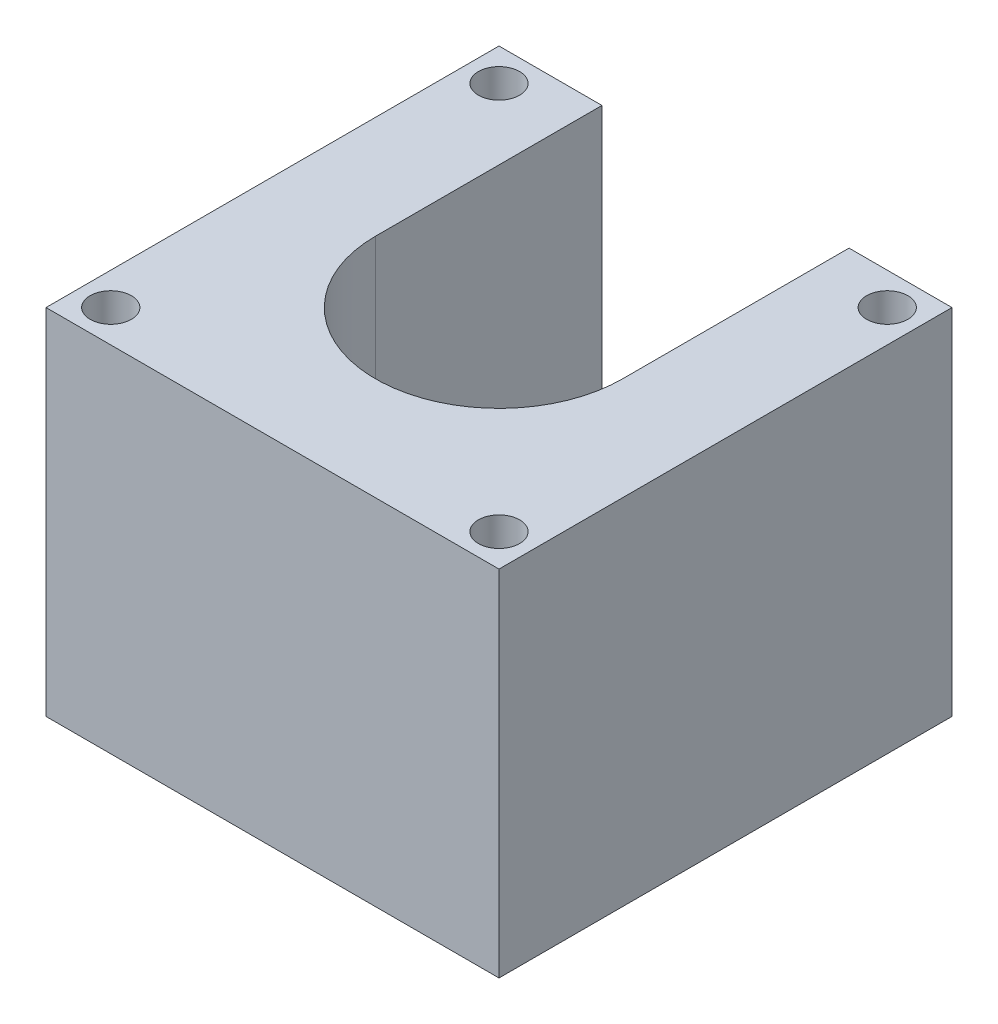
ISO-10303-21;
HEADER;
FILE_DESCRIPTION(('STEP AP214'),'2;1');
FILE_NAME('part.step','',(''),(''),'','','');
FILE_SCHEMA(('AUTOMOTIVE_DESIGN { 1 0 10303 214 1 1 1 1 }'));
ENDSEC;
DATA;
#1=APPLICATION_CONTEXT('core data for automotive mechanical design processes');
#2=APPLICATION_PROTOCOL_DEFINITION('international standard','automotive_design',2000,#1);
#3=PRODUCT_CONTEXT('',#1,'mechanical');
#4=PRODUCT('Part','Part','',(#3));
#5=PRODUCT_RELATED_PRODUCT_CATEGORY('part','',(#4));
#6=PRODUCT_DEFINITION_FORMATION('','',#4);
#7=PRODUCT_DEFINITION_CONTEXT('part definition',#1,'design');
#8=PRODUCT_DEFINITION('design','',#6,#7);
#9=PRODUCT_DEFINITION_SHAPE('','',#8);
#10=(LENGTH_UNIT() NAMED_UNIT(*) SI_UNIT(.MILLI.,.METRE.));
#11=(NAMED_UNIT(*) PLANE_ANGLE_UNIT() SI_UNIT($,.RADIAN.));
#12=(NAMED_UNIT(*) SI_UNIT($,.STERADIAN.) SOLID_ANGLE_UNIT());
#13=UNCERTAINTY_MEASURE_WITH_UNIT(LENGTH_MEASURE(1.E-05),#10,'distance_accuracy_value','');
#14=(GEOMETRIC_REPRESENTATION_CONTEXT(3) GLOBAL_UNCERTAINTY_ASSIGNED_CONTEXT((#13)) GLOBAL_UNIT_ASSIGNED_CONTEXT((#10,
#11,#12)) REPRESENTATION_CONTEXT('',''));
#15=CARTESIAN_POINT('',(0.,0.,0.));
#16=DIRECTION('',(0.,0.,1.));
#17=DIRECTION('',(1.,0.,0.));
#18=AXIS2_PLACEMENT_3D('',#15,#16,#17);
#19=CARTESIAN_POINT('',(0.,9.,0.));
#20=DIRECTION('',(0.,1.,0.));
#21=DIRECTION('',(0.,0.,1.));
#22=AXIS2_PLACEMENT_3D('',#19,#20,#21);
#23=PLANE('',#22);
#24=CARTESIAN_POINT('',(-0.141805914216586,9.,-1.24028438149424));
#25=DIRECTION('',(0.,1.,0.));
#26=DIRECTION('',(0.,0.,1.));
#27=AXIS2_PLACEMENT_3D('',#24,#25,#26);
#28=CIRCLE('',#27,15.);
#29=CARTESIAN_POINT('',(14.8581940857834,9.,-1.24028438149424));
#30=VERTEX_POINT('',#29);
#31=CARTESIAN_POINT('',(-15.1418059142166,9.,-1.24028438149424));
#32=VERTEX_POINT('',#31);
#33=EDGE_CURVE('E55',#30,#32,#28,.T.);
#34=ORIENTED_EDGE('',*,*,#33,.F.);
#35=DIRECTION('',(0.,0.,-1.));
#36=VECTOR('',#35,1.);
#37=CARTESIAN_POINT('',(14.8581940857834,9.,0.));
#38=LINE('',#37,#36);
#39=CARTESIAN_POINT('',(14.8581940857834,9.,-28.7402843814942));
#40=VERTEX_POINT('',#39);
#41=EDGE_CURVE('E105',#30,#40,#38,.T.);
#42=ORIENTED_EDGE('',*,*,#41,.T.);
#43=DIRECTION('',(-1.,0.,0.));
#44=VECTOR('',#43,1.);
#45=CARTESIAN_POINT('',(-27.6418059142166,9.,-28.7402843814942));
#46=LINE('',#45,#44);
#47=CARTESIAN_POINT('',(-15.1418059142166,9.,-28.7402843814942));
#48=VERTEX_POINT('',#47);
#49=EDGE_CURVE('E168',#40,#48,#46,.T.);
#50=ORIENTED_EDGE('',*,*,#49,.T.);
#51=DIRECTION('',(0.,0.,-1.));
#52=VECTOR('',#51,1.);
#53=CARTESIAN_POINT('',(-15.1418059142166,9.,0.));
#54=LINE('',#53,#52);
#55=EDGE_CURVE('E51',#32,#48,#54,.T.);
#56=ORIENTED_EDGE('',*,*,#55,.F.);
#57=EDGE_LOOP('',(#34,#42,#50,#56));
#58=FACE_BOUND('',#57,.T.);
#59=ADVANCED_FACE('F34',(#58),#23,.T.);
#60=CARTESIAN_POINT('',(0.,0.,0.));
#61=DIRECTION('',(0.,1.,0.));
#62=DIRECTION('',(0.,0.,1.));
#63=AXIS2_PLACEMENT_3D('',#60,#61,#62);
#64=PLANE('',#63);
#65=CARTESIAN_POINT('',(23.4281940857834,0.,-24.8102843814942));
#66=DIRECTION('',(0.,-1.,0.));
#67=DIRECTION('',(0.,0.,-1.));
#68=AXIS2_PLACEMENT_3D('',#65,#66,#67);
#69=CIRCLE('',#68,2.5);
#70=CARTESIAN_POINT('',(23.4281940857834,0.,-27.3102843814942));
#71=VERTEX_POINT('',#70);
#72=EDGE_CURVE('E258',#71,#71,#69,.T.);
#73=ORIENTED_EDGE('',*,*,#72,.F.);
#74=EDGE_LOOP('',(#73));
#75=FACE_BOUND('',#74,.T.);
#76=CARTESIAN_POINT('',(-23.7118059142166,0.,-24.8102843814942));
#77=DIRECTION('',(0.,-1.,0.));
#78=DIRECTION('',(0.,0.,-1.));
#79=AXIS2_PLACEMENT_3D('',#76,#77,#78);
#80=CIRCLE('',#79,2.5);
#81=CARTESIAN_POINT('',(-23.7118059142166,0.,-27.3102843814942));
#82=VERTEX_POINT('',#81);
#83=EDGE_CURVE('E262',#82,#82,#80,.T.);
#84=ORIENTED_EDGE('',*,*,#83,.F.);
#85=EDGE_LOOP('',(#84));
#86=FACE_BOUND('',#85,.T.);
#87=CARTESIAN_POINT('',(23.4281940857834,0.,22.3297156185058));
#88=DIRECTION('',(0.,-1.,0.));
#89=DIRECTION('',(0.,0.,-1.));
#90=AXIS2_PLACEMENT_3D('',#87,#88,#89);
#91=CIRCLE('',#90,2.5);
#92=CARTESIAN_POINT('',(23.4281940857834,0.,19.8297156185058));
#93=VERTEX_POINT('',#92);
#94=EDGE_CURVE('E269',#93,#93,#91,.T.);
#95=ORIENTED_EDGE('',*,*,#94,.F.);
#96=EDGE_LOOP('',(#95));
#97=FACE_BOUND('',#96,.T.);
#98=CARTESIAN_POINT('',(-23.7118059142166,0.,22.3297156185058));
#99=DIRECTION('',(0.,-1.,0.));
#100=DIRECTION('',(0.,0.,-1.));
#101=AXIS2_PLACEMENT_3D('',#98,#99,#100);
#102=CIRCLE('',#101,2.5);
#103=CARTESIAN_POINT('',(-23.7118059142166,0.,19.8297156185058));
#104=VERTEX_POINT('',#103);
#105=EDGE_CURVE('E148',#104,#104,#102,.T.);
#106=ORIENTED_EDGE('',*,*,#105,.F.);
#107=EDGE_LOOP('',(#106));
#108=FACE_BOUND('',#107,.T.);
#109=DIRECTION('',(0.,0.,1.));
#110=VECTOR('',#109,1.);
#111=CARTESIAN_POINT('',(-27.6418059142166,0.,-28.7402843814942));
#112=LINE('',#111,#110);
#113=CARTESIAN_POINT('',(-27.6418059142166,0.,-28.7402843814942));
#114=VERTEX_POINT('',#113);
#115=CARTESIAN_POINT('',(-27.6418059142166,0.,26.2597156185058));
#116=VERTEX_POINT('',#115);
#117=EDGE_CURVE('E167',#114,#116,#112,.T.);
#118=ORIENTED_EDGE('',*,*,#117,.F.);
#119=DIRECTION('',(-1.,0.,0.));
#120=VECTOR('',#119,1.);
#121=CARTESIAN_POINT('',(-27.6418059142166,0.,-28.7402843814942));
#122=LINE('',#121,#120);
#123=CARTESIAN_POINT('',(27.3581940857834,0.,-28.7402843814942));
#124=VERTEX_POINT('',#123);
#125=EDGE_CURVE('E171',#124,#114,#122,.T.);
#126=ORIENTED_EDGE('',*,*,#125,.F.);
#127=DIRECTION('',(0.,0.,-1.));
#128=VECTOR('',#127,1.);
#129=CARTESIAN_POINT('',(27.3581940857834,0.,-28.7402843814942));
#130=LINE('',#129,#128);
#131=CARTESIAN_POINT('',(27.3581940857834,0.,26.2597156185058));
#132=VERTEX_POINT('',#131);
#133=EDGE_CURVE('E179',#132,#124,#130,.T.);
#134=ORIENTED_EDGE('',*,*,#133,.F.);
#135=DIRECTION('',(1.,0.,0.));
#136=VECTOR('',#135,1.);
#137=CARTESIAN_POINT('',(-27.6418059142166,0.,26.2597156185058));
#138=LINE('',#137,#136);
#139=EDGE_CURVE('E177',#116,#132,#138,.T.);
#140=ORIENTED_EDGE('',*,*,#139,.F.);
#141=EDGE_LOOP('',(#118,#126,#134,#140));
#142=FACE_BOUND('',#141,.T.);
#143=CARTESIAN_POINT('',(-0.141805914216586,0.,-1.24028438149424));
#144=DIRECTION('',(0.,1.,0.));
#145=DIRECTION('',(0.,0.,1.));
#146=AXIS2_PLACEMENT_3D('',#143,#144,#145);
#147=CIRCLE('',#146,15.);
#148=CARTESIAN_POINT('',(-0.141805914216586,0.,13.7597156185058));
#149=VERTEX_POINT('',#148);
#150=EDGE_CURVE('E107',#149,#149,#147,.T.);
#151=ORIENTED_EDGE('',*,*,#150,.T.);
#152=EDGE_LOOP('',(#151));
#153=FACE_BOUND('',#152,.T.);
#154=ADVANCED_FACE('F196',(#75,#86,#97,#108,#142,#153),#64,.F.);
#155=CARTESIAN_POINT('',(-27.6418059142166,9.,-28.7402843814942));
#156=DIRECTION('',(1.,0.,0.));
#157=DIRECTION('',(0.,0.,-1.));
#158=AXIS2_PLACEMENT_3D('',#155,#156,#157);
#159=PLANE('',#158);
#160=ORIENTED_EDGE('',*,*,#117,.T.);
#161=DIRECTION('',(0.,-1.,0.));
#162=VECTOR('',#161,1.);
#163=CARTESIAN_POINT('',(-27.6418059142166,9.,26.2597156185058));
#164=LINE('',#163,#162);
#165=CARTESIAN_POINT('',(-27.6418059142166,43.,26.2597156185058));
#166=VERTEX_POINT('',#165);
#167=EDGE_CURVE('E11',#166,#116,#164,.T.);
#168=ORIENTED_EDGE('',*,*,#167,.F.);
#169=DIRECTION('',(0.,0.,1.));
#170=VECTOR('',#169,1.);
#171=CARTESIAN_POINT('',(-27.6418059142166,43.,0.));
#172=LINE('',#171,#170);
#173=CARTESIAN_POINT('',(-27.6418059142166,43.,-28.7402843814942));
#174=VERTEX_POINT('',#173);
#175=EDGE_CURVE('E134',#174,#166,#172,.T.);
#176=ORIENTED_EDGE('',*,*,#175,.F.);
#177=DIRECTION('',(0.,-1.,0.));
#178=VECTOR('',#177,1.);
#179=CARTESIAN_POINT('',(-27.6418059142166,9.,-28.7402843814942));
#180=LINE('',#179,#178);
#181=EDGE_CURVE('E170',#174,#114,#180,.T.);
#182=ORIENTED_EDGE('',*,*,#181,.T.);
#183=EDGE_LOOP('',(#160,#168,#176,#182));
#184=FACE_BOUND('',#183,.T.);
#185=ADVANCED_FACE('F36',(#184),#159,.F.);
#186=CARTESIAN_POINT('',(-27.6418059142166,9.,26.2597156185058));
#187=DIRECTION('',(0.,0.,-1.));
#188=DIRECTION('',(-1.,0.,0.));
#189=AXIS2_PLACEMENT_3D('',#186,#187,#188);
#190=PLANE('',#189);
#191=ORIENTED_EDGE('',*,*,#139,.T.);
#192=DIRECTION('',(0.,-1.,0.));
#193=VECTOR('',#192,1.);
#194=CARTESIAN_POINT('',(27.3581940857834,9.,26.2597156185058));
#195=LINE('',#194,#193);
#196=CARTESIAN_POINT('',(27.3581940857834,43.,26.2597156185058));
#197=VERTEX_POINT('',#196);
#198=EDGE_CURVE('E43',#197,#132,#195,.T.);
#199=ORIENTED_EDGE('',*,*,#198,.F.);
#200=DIRECTION('',(1.,0.,0.));
#201=VECTOR('',#200,1.);
#202=CARTESIAN_POINT('',(0.,43.,26.2597156185058));
#203=LINE('',#202,#201);
#204=EDGE_CURVE('E137',#166,#197,#203,.T.);
#205=ORIENTED_EDGE('',*,*,#204,.F.);
#206=ORIENTED_EDGE('',*,*,#167,.T.);
#207=EDGE_LOOP('',(#191,#199,#205,#206));
#208=FACE_BOUND('',#207,.T.);
#209=ADVANCED_FACE('F201',(#208),#190,.F.);
#210=CARTESIAN_POINT('',(27.3581940857834,9.,-28.7402843814942));
#211=DIRECTION('',(-1.,0.,0.));
#212=DIRECTION('',(0.,0.,1.));
#213=AXIS2_PLACEMENT_3D('',#210,#211,#212);
#214=PLANE('',#213);
#215=ORIENTED_EDGE('',*,*,#133,.T.);
#216=DIRECTION('',(0.,-1.,0.));
#217=VECTOR('',#216,1.);
#218=CARTESIAN_POINT('',(27.3581940857834,9.,-28.7402843814942));
#219=LINE('',#218,#217);
#220=CARTESIAN_POINT('',(27.3581940857834,43.,-28.7402843814942));
#221=VERTEX_POINT('',#220);
#222=EDGE_CURVE('E184',#221,#124,#219,.T.);
#223=ORIENTED_EDGE('',*,*,#222,.F.);
#224=DIRECTION('',(0.,0.,-1.));
#225=VECTOR('',#224,1.);
#226=CARTESIAN_POINT('',(27.3581940857834,43.,0.));
#227=LINE('',#226,#225);
#228=EDGE_CURVE('E140',#197,#221,#227,.T.);
#229=ORIENTED_EDGE('',*,*,#228,.F.);
#230=ORIENTED_EDGE('',*,*,#198,.T.);
#231=EDGE_LOOP('',(#215,#223,#229,#230));
#232=FACE_BOUND('',#231,.T.);
#233=ADVANCED_FACE('F190',(#232),#214,.F.);
#234=CARTESIAN_POINT('',(-27.6418059142166,9.,-28.7402843814942));
#235=DIRECTION('',(0.,0.,1.));
#236=DIRECTION('',(1.,0.,0.));
#237=AXIS2_PLACEMENT_3D('',#234,#235,#236);
#238=PLANE('',#237);
#239=ORIENTED_EDGE('',*,*,#125,.T.);
#240=ORIENTED_EDGE('',*,*,#181,.F.);
#241=DIRECTION('',(-1.,0.,0.));
#242=VECTOR('',#241,1.);
#243=CARTESIAN_POINT('',(0.,43.,-28.7402843814942));
#244=LINE('',#243,#242);
#245=CARTESIAN_POINT('',(-15.1418059142166,43.,-28.7402843814942));
#246=VERTEX_POINT('',#245);
#247=EDGE_CURVE('E131',#246,#174,#244,.T.);
#248=ORIENTED_EDGE('',*,*,#247,.F.);
#249=DIRECTION('',(0.,-1.,0.));
#250=VECTOR('',#249,1.);
#251=CARTESIAN_POINT('',(-15.1418059142166,43.,-28.7402843814942));
#252=LINE('',#251,#250);
#253=EDGE_CURVE('E151',#246,#48,#252,.T.);
#254=ORIENTED_EDGE('',*,*,#253,.T.);
#255=ORIENTED_EDGE('',*,*,#49,.F.);
#256=DIRECTION('',(0.,-1.,0.));
#257=VECTOR('',#256,1.);
#258=CARTESIAN_POINT('',(14.8581940857834,43.,-28.7402843814942));
#259=LINE('',#258,#257);
#260=CARTESIAN_POINT('',(14.8581940857834,43.,-28.7402843814942));
#261=VERTEX_POINT('',#260);
#262=EDGE_CURVE('E150',#261,#40,#259,.T.);
#263=ORIENTED_EDGE('',*,*,#262,.F.);
#264=EDGE_CURVE('E122',#221,#261,#244,.T.);
#265=ORIENTED_EDGE('',*,*,#264,.F.);
#266=ORIENTED_EDGE('',*,*,#222,.T.);
#267=EDGE_LOOP('',(#239,#240,#248,#254,#255,#263,#265,#266));
#268=FACE_BOUND('',#267,.T.);
#269=ADVANCED_FACE('F198',(#268),#238,.F.);
#270=CARTESIAN_POINT('',(-0.141805914216586,9.,-1.24028438149424));
#271=DIRECTION('',(0.,-1.,0.));
#272=DIRECTION('',(0.,0.,-1.));
#273=AXIS2_PLACEMENT_3D('',#270,#271,#272);
#274=CYLINDRICAL_SURFACE('',#273,15.);
#275=ORIENTED_EDGE('',*,*,#33,.T.);
#276=DIRECTION('',(0.,-1.,0.));
#277=VECTOR('',#276,1.);
#278=CARTESIAN_POINT('',(-15.1418059142166,43.,-1.24028438149424));
#279=LINE('',#278,#277);
#280=CARTESIAN_POINT('',(-15.1418059142166,43.,-1.24028438149424));
#281=VERTEX_POINT('',#280);
#282=EDGE_CURVE('E108',#281,#32,#279,.T.);
#283=ORIENTED_EDGE('',*,*,#282,.F.);
#284=CARTESIAN_POINT('',(-0.141805914216586,43.,-1.24028438149424));
#285=DIRECTION('',(0.,1.,0.));
#286=DIRECTION('',(0.,0.,1.));
#287=AXIS2_PLACEMENT_3D('',#284,#285,#286);
#288=CIRCLE('',#287,15.);
#289=CARTESIAN_POINT('',(14.8581940857834,43.,-1.24028438149424));
#290=VERTEX_POINT('',#289);
#291=EDGE_CURVE('E111',#290,#281,#288,.F.);
#292=ORIENTED_EDGE('',*,*,#291,.F.);
#293=DIRECTION('',(0.,-1.,0.));
#294=VECTOR('',#293,1.);
#295=CARTESIAN_POINT('',(14.8581940857834,43.,-1.24028438149424));
#296=LINE('',#295,#294);
#297=EDGE_CURVE('E99',#290,#30,#296,.T.);
#298=ORIENTED_EDGE('',*,*,#297,.T.);
#299=EDGE_LOOP('',(#275,#283,#292,#298));
#300=FACE_BOUND('',#299,.T.);
#301=ORIENTED_EDGE('',*,*,#150,.F.);
#302=EDGE_LOOP('',(#301));
#303=FACE_BOUND('',#302,.T.);
#304=ADVANCED_FACE('F112',(#300,#303),#274,.F.);
#305=CARTESIAN_POINT('',(14.8581940857834,43.,0.));
#306=DIRECTION('',(-1.,0.,0.));
#307=DIRECTION('',(0.,0.,1.));
#308=AXIS2_PLACEMENT_3D('',#305,#306,#307);
#309=PLANE('',#308);
#310=ORIENTED_EDGE('',*,*,#41,.F.);
#311=ORIENTED_EDGE('',*,*,#297,.F.);
#312=DIRECTION('',(0.,0.,-1.));
#313=VECTOR('',#312,1.);
#314=CARTESIAN_POINT('',(14.8581940857834,43.,0.));
#315=LINE('',#314,#313);
#316=EDGE_CURVE('E104',#290,#261,#315,.T.);
#317=ORIENTED_EDGE('',*,*,#316,.T.);
#318=ORIENTED_EDGE('',*,*,#262,.T.);
#319=EDGE_LOOP('',(#310,#311,#317,#318));
#320=FACE_BOUND('',#319,.T.);
#321=ADVANCED_FACE('F101',(#320),#309,.T.);
#322=CARTESIAN_POINT('',(-15.1418059142166,43.,0.));
#323=DIRECTION('',(-1.,0.,0.));
#324=DIRECTION('',(0.,0.,1.));
#325=AXIS2_PLACEMENT_3D('',#322,#323,#324);
#326=PLANE('',#325);
#327=ORIENTED_EDGE('',*,*,#55,.T.);
#328=ORIENTED_EDGE('',*,*,#253,.F.);
#329=DIRECTION('',(0.,0.,-1.));
#330=VECTOR('',#329,1.);
#331=CARTESIAN_POINT('',(-15.1418059142166,43.,0.));
#332=LINE('',#331,#330);
#333=EDGE_CURVE('E117',#281,#246,#332,.T.);
#334=ORIENTED_EDGE('',*,*,#333,.F.);
#335=ORIENTED_EDGE('',*,*,#282,.T.);
#336=EDGE_LOOP('',(#327,#328,#334,#335));
#337=FACE_BOUND('',#336,.T.);
#338=ADVANCED_FACE('F225',(#337),#326,.F.);
#339=CARTESIAN_POINT('',(0.,43.,0.));
#340=DIRECTION('',(0.,1.,0.));
#341=DIRECTION('',(0.,0.,1.));
#342=AXIS2_PLACEMENT_3D('',#339,#340,#341);
#343=PLANE('',#342);
#344=CARTESIAN_POINT('',(23.4281940857834,43.,-24.8102843814942));
#345=DIRECTION('',(0.,1.,0.));
#346=DIRECTION('',(0.,0.,1.));
#347=AXIS2_PLACEMENT_3D('',#344,#345,#346);
#348=CIRCLE('',#347,2.5);
#349=CARTESIAN_POINT('',(23.4281940857834,43.,-22.3102843814942));
#350=VERTEX_POINT('',#349);
#351=EDGE_CURVE('E255',#350,#350,#348,.F.);
#352=ORIENTED_EDGE('',*,*,#351,.T.);
#353=EDGE_LOOP('',(#352));
#354=FACE_BOUND('',#353,.T.);
#355=CARTESIAN_POINT('',(-23.7118059142166,43.,-24.8102843814942));
#356=DIRECTION('',(0.,1.,0.));
#357=DIRECTION('',(0.,0.,1.));
#358=AXIS2_PLACEMENT_3D('',#355,#356,#357);
#359=CIRCLE('',#358,2.5);
#360=CARTESIAN_POINT('',(-23.7118059142166,43.,-22.3102843814942));
#361=VERTEX_POINT('',#360);
#362=EDGE_CURVE('E259',#361,#361,#359,.F.);
#363=ORIENTED_EDGE('',*,*,#362,.T.);
#364=EDGE_LOOP('',(#363));
#365=FACE_BOUND('',#364,.T.);
#366=CARTESIAN_POINT('',(23.4281940857834,43.,22.3297156185058));
#367=DIRECTION('',(0.,1.,0.));
#368=DIRECTION('',(0.,0.,1.));
#369=AXIS2_PLACEMENT_3D('',#366,#367,#368);
#370=CIRCLE('',#369,2.5);
#371=CARTESIAN_POINT('',(23.4281940857834,43.,24.8297156185058));
#372=VERTEX_POINT('',#371);
#373=EDGE_CURVE('E267',#372,#372,#370,.F.);
#374=ORIENTED_EDGE('',*,*,#373,.T.);
#375=EDGE_LOOP('',(#374));
#376=FACE_BOUND('',#375,.T.);
#377=CARTESIAN_POINT('',(-23.7118059142166,43.,22.3297156185058));
#378=DIRECTION('',(0.,1.,0.));
#379=DIRECTION('',(0.,0.,1.));
#380=AXIS2_PLACEMENT_3D('',#377,#378,#379);
#381=CIRCLE('',#380,2.5);
#382=CARTESIAN_POINT('',(-23.7118059142166,43.,24.8297156185058));
#383=VERTEX_POINT('',#382);
#384=EDGE_CURVE('E127',#383,#383,#381,.F.);
#385=ORIENTED_EDGE('',*,*,#384,.T.);
#386=EDGE_LOOP('',(#385));
#387=FACE_BOUND('',#386,.T.);
#388=ORIENTED_EDGE('',*,*,#316,.F.);
#389=ORIENTED_EDGE('',*,*,#291,.T.);
#390=ORIENTED_EDGE('',*,*,#333,.T.);
#391=ORIENTED_EDGE('',*,*,#247,.T.);
#392=ORIENTED_EDGE('',*,*,#175,.T.);
#393=ORIENTED_EDGE('',*,*,#204,.T.);
#394=ORIENTED_EDGE('',*,*,#228,.T.);
#395=ORIENTED_EDGE('',*,*,#264,.T.);
#396=EDGE_LOOP('',(#388,#389,#390,#391,#392,#393,#394,#395));
#397=FACE_BOUND('',#396,.T.);
#398=ADVANCED_FACE('F119',(#354,#365,#376,#387,#397),#343,.T.);
#399=CARTESIAN_POINT('',(-23.7118059142166,43.001025,22.3297156185058));
#400=DIRECTION('',(0.,-1.,0.));
#401=DIRECTION('',(0.,0.,-1.));
#402=AXIS2_PLACEMENT_3D('',#399,#400,#401);
#403=CYLINDRICAL_SURFACE('',#402,2.5);
#404=ORIENTED_EDGE('',*,*,#384,.F.);
#405=EDGE_LOOP('',(#404));
#406=FACE_BOUND('',#405,.T.);
#407=ORIENTED_EDGE('',*,*,#105,.T.);
#408=EDGE_LOOP('',(#407));
#409=FACE_BOUND('',#408,.T.);
#410=ADVANCED_FACE('F234',(#406,#409),#403,.F.);
#411=CARTESIAN_POINT('',(23.4281940857834,43.001025,22.3297156185058));
#412=DIRECTION('',(0.,-1.,0.));
#413=DIRECTION('',(0.,0.,-1.));
#414=AXIS2_PLACEMENT_3D('',#411,#412,#413);
#415=CYLINDRICAL_SURFACE('',#414,2.5);
#416=ORIENTED_EDGE('',*,*,#373,.F.);
#417=EDGE_LOOP('',(#416));
#418=FACE_BOUND('',#417,.T.);
#419=ORIENTED_EDGE('',*,*,#94,.T.);
#420=EDGE_LOOP('',(#419));
#421=FACE_BOUND('',#420,.T.);
#422=ADVANCED_FACE('F238',(#418,#421),#415,.F.);
#423=CARTESIAN_POINT('',(-23.7118059142166,43.001025,-24.8102843814942));
#424=DIRECTION('',(0.,-1.,0.));
#425=DIRECTION('',(0.,0.,-1.));
#426=AXIS2_PLACEMENT_3D('',#423,#424,#425);
#427=CYLINDRICAL_SURFACE('',#426,2.5);
#428=ORIENTED_EDGE('',*,*,#362,.F.);
#429=EDGE_LOOP('',(#428));
#430=FACE_BOUND('',#429,.T.);
#431=ORIENTED_EDGE('',*,*,#83,.T.);
#432=EDGE_LOOP('',(#431));
#433=FACE_BOUND('',#432,.T.);
#434=ADVANCED_FACE('F242',(#430,#433),#427,.F.);
#435=CARTESIAN_POINT('',(23.4281940857834,43.001025,-24.8102843814942));
#436=DIRECTION('',(0.,-1.,0.));
#437=DIRECTION('',(0.,0.,-1.));
#438=AXIS2_PLACEMENT_3D('',#435,#436,#437);
#439=CYLINDRICAL_SURFACE('',#438,2.5);
#440=ORIENTED_EDGE('',*,*,#351,.F.);
#441=EDGE_LOOP('',(#440));
#442=FACE_BOUND('',#441,.T.);
#443=ORIENTED_EDGE('',*,*,#72,.T.);
#444=EDGE_LOOP('',(#443));
#445=FACE_BOUND('',#444,.T.);
#446=ADVANCED_FACE('F246',(#442,#445),#439,.F.);
#447=CLOSED_SHELL('',(#59,#154,#185,#209,#233,#269,#304,#321,#338,#398,#410,#422,#434,#446));
#448=MANIFOLD_SOLID_BREP('B2',#447);
#449=ADVANCED_BREP_SHAPE_REPRESENTATION('',(#18,#448),#14);
#450=SHAPE_DEFINITION_REPRESENTATION(#9,#449);
ENDSEC;
END-ISO-10303-21;
